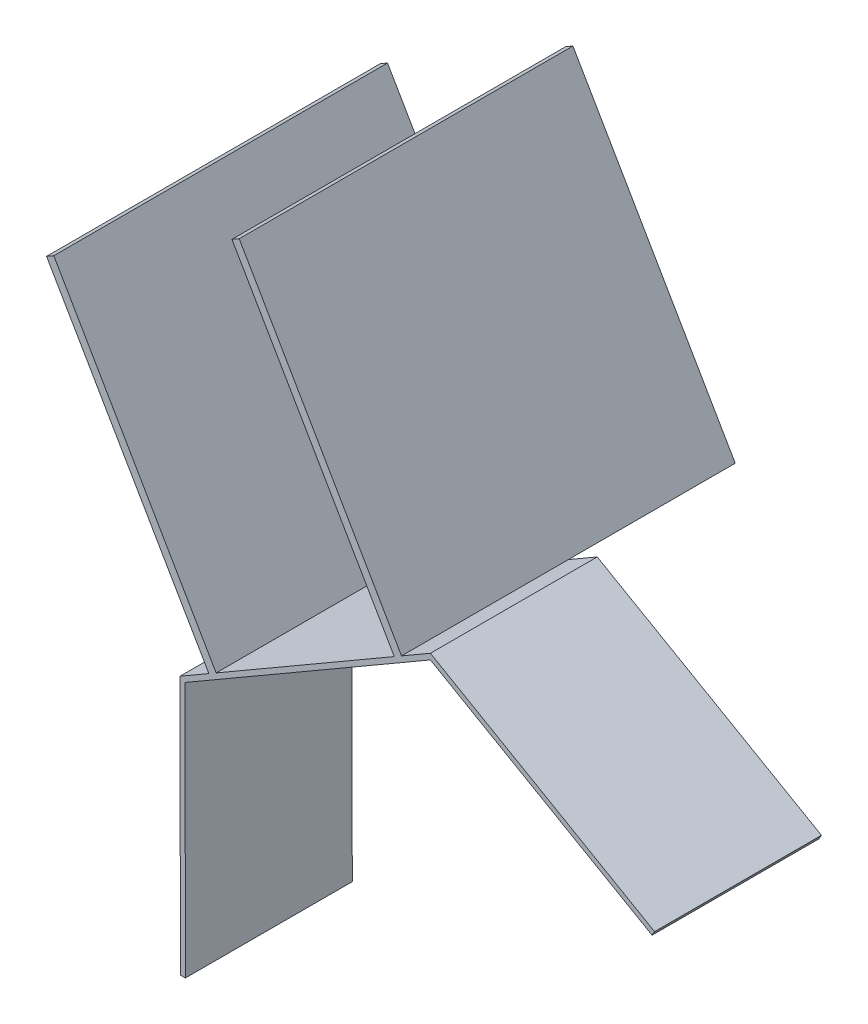
ISO-10303-21;
HEADER;
FILE_DESCRIPTION(('STEP AP214'),'2;1');
FILE_NAME('part.step','',(''),(''),'','','');
FILE_SCHEMA(('AUTOMOTIVE_DESIGN { 1 0 10303 214 1 1 1 1 }'));
ENDSEC;
DATA;
#1=APPLICATION_CONTEXT('core data for automotive mechanical design processes');
#2=APPLICATION_PROTOCOL_DEFINITION('international standard','automotive_design',2000,#1);
#3=PRODUCT_CONTEXT('',#1,'mechanical');
#4=PRODUCT('Part','Part','',(#3));
#5=PRODUCT_RELATED_PRODUCT_CATEGORY('part','',(#4));
#6=PRODUCT_DEFINITION_FORMATION('','',#4);
#7=PRODUCT_DEFINITION_CONTEXT('part definition',#1,'design');
#8=PRODUCT_DEFINITION('design','',#6,#7);
#9=PRODUCT_DEFINITION_SHAPE('','',#8);
#10=(LENGTH_UNIT() NAMED_UNIT(*) SI_UNIT(.MILLI.,.METRE.));
#11=(NAMED_UNIT(*) PLANE_ANGLE_UNIT() SI_UNIT($,.RADIAN.));
#12=(NAMED_UNIT(*) SI_UNIT($,.STERADIAN.) SOLID_ANGLE_UNIT());
#13=UNCERTAINTY_MEASURE_WITH_UNIT(LENGTH_MEASURE(1.E-05),#10,'distance_accuracy_value','');
#14=(GEOMETRIC_REPRESENTATION_CONTEXT(3) GLOBAL_UNCERTAINTY_ASSIGNED_CONTEXT((#13)) GLOBAL_UNIT_ASSIGNED_CONTEXT((#10,
#11,#12)) REPRESENTATION_CONTEXT('',''));
#15=CARTESIAN_POINT('',(0.,0.,0.));
#16=DIRECTION('',(0.,0.,1.));
#17=DIRECTION('',(1.,0.,0.));
#18=AXIS2_PLACEMENT_3D('',#15,#16,#17);
#19=CARTESIAN_POINT('',(-529.334093447902,913.551431110648,50.));
#20=DIRECTION('',(-0.501345446576402,0.865247215076193,0.));
#21=DIRECTION('',(-0.865247215076193,-0.501345446576402,0.));
#22=AXIS2_PLACEMENT_3D('',#19,#20,#21);
#23=PLANE('',#22);
#24=DIRECTION('',(0.865247215076193,0.501345446576402,0.));
#25=VECTOR('',#24,1.);
#26=CARTESIAN_POINT('',(-529.334093447902,913.551431110648,50.));
#27=LINE('',#26,#25);
#28=CARTESIAN_POINT('',(-605.658970562719,869.326926327183,50.));
#29=VERTEX_POINT('',#28);
#30=CARTESIAN_POINT('',(-588.354026261196,879.353835258712,50.));
#31=VERTEX_POINT('',#30);
#32=EDGE_CURVE('E233',#29,#31,#27,.T.);
#33=ORIENTED_EDGE('',*,*,#32,.T.);
#34=DIRECTION('',(0.,0.,1.));
#35=VECTOR('',#34,1.);
#36=CARTESIAN_POINT('',(-588.354026261196,879.353835258712,-150.));
#37=LINE('',#36,#35);
#38=CARTESIAN_POINT('',(-588.354026261196,879.353835258712,-50.));
#39=VERTEX_POINT('',#38);
#40=EDGE_CURVE('E189',#39,#31,#37,.T.);
#41=ORIENTED_EDGE('',*,*,#40,.F.);
#42=DIRECTION('',(0.865247215076193,0.501345446576402,0.));
#43=VECTOR('',#42,1.);
#44=CARTESIAN_POINT('',(-529.334093447902,913.551431110648,-50.));
#45=LINE('',#44,#43);
#46=CARTESIAN_POINT('',(-605.658970562719,869.326926327183,-50.));
#47=VERTEX_POINT('',#46);
#48=EDGE_CURVE('E256',#47,#39,#45,.T.);
#49=ORIENTED_EDGE('',*,*,#48,.F.);
#50=DIRECTION('',(0.,0.,-1.));
#51=VECTOR('',#50,1.);
#52=CARTESIAN_POINT('',(-605.658970562719,869.326926327183,50.));
#53=LINE('',#52,#51);
#54=EDGE_CURVE('E280',#29,#47,#53,.T.);
#55=ORIENTED_EDGE('',*,*,#54,.F.);
#56=EDGE_LOOP('',(#33,#41,#49,#55));
#57=FACE_BOUND('',#56,.T.);
#58=ADVANCED_FACE('F37',(#57),#23,.T.);
#59=CARTESIAN_POINT('',(-584.027790185814,881.860562491593,-50.));
#60=VERTEX_POINT('',#59);
#61=CARTESIAN_POINT('',(-477.253300681142,943.728319117628,-50.));
#62=VERTEX_POINT('',#61);
#63=EDGE_CURVE('E261',#60,#62,#45,.T.);
#64=ORIENTED_EDGE('',*,*,#63,.F.);
#65=DIRECTION('',(0.,0.,-1.));
#66=VECTOR('',#65,1.);
#67=CARTESIAN_POINT('',(-584.027790185815,881.860562491594,-150.));
#68=LINE('',#67,#66);
#69=CARTESIAN_POINT('',(-584.027790185815,881.860562491594,50.));
#70=VERTEX_POINT('',#69);
#71=EDGE_CURVE('E52',#70,#60,#68,.T.);
#72=ORIENTED_EDGE('',*,*,#71,.F.);
#73=CARTESIAN_POINT('',(-477.253300681142,943.728319117628,50.));
#74=VERTEX_POINT('',#73);
#75=EDGE_CURVE('E236',#70,#74,#27,.T.);
#76=ORIENTED_EDGE('',*,*,#75,.T.);
#77=DIRECTION('',(0.,0.,1.));
#78=VECTOR('',#77,1.);
#79=CARTESIAN_POINT('',(-477.253300681142,943.728319117628,-150.));
#80=LINE('',#79,#78);
#81=EDGE_CURVE('E210',#62,#74,#80,.T.);
#82=ORIENTED_EDGE('',*,*,#81,.F.);
#83=EDGE_LOOP('',(#64,#72,#76,#82));
#84=FACE_BOUND('',#83,.T.);
#85=ADVANCED_FACE('F356',(#84),#23,.T.);
#86=CARTESIAN_POINT('',(-472.92706460576,946.235046350509,-50.));
#87=VERTEX_POINT('',#86);
#88=CARTESIAN_POINT('',(-455.622120304236,956.261955282037,-50.));
#89=VERTEX_POINT('',#88);
#90=EDGE_CURVE('E255',#87,#89,#45,.T.);
#91=ORIENTED_EDGE('',*,*,#90,.F.);
#92=DIRECTION('',(0.,0.,-1.));
#93=VECTOR('',#92,1.);
#94=CARTESIAN_POINT('',(-472.927064605761,946.23504635051,-150.));
#95=LINE('',#94,#93);
#96=CARTESIAN_POINT('',(-472.927064605761,946.23504635051,50.));
#97=VERTEX_POINT('',#96);
#98=EDGE_CURVE('E60',#97,#87,#95,.T.);
#99=ORIENTED_EDGE('',*,*,#98,.F.);
#100=CARTESIAN_POINT('',(-455.622120304236,956.261955282037,50.));
#101=VERTEX_POINT('',#100);
#102=EDGE_CURVE('E232',#97,#101,#27,.T.);
#103=ORIENTED_EDGE('',*,*,#102,.T.);
#104=DIRECTION('',(0.,0.,-1.));
#105=VECTOR('',#104,1.);
#106=CARTESIAN_POINT('',(-455.622120304236,956.261955282037,50.));
#107=LINE('',#106,#105);
#108=EDGE_CURVE('E282',#101,#89,#107,.T.);
#109=ORIENTED_EDGE('',*,*,#108,.T.);
#110=EDGE_LOOP('',(#91,#99,#103,#109));
#111=FACE_BOUND('',#110,.T.);
#112=ADVANCED_FACE('F300',(#111),#23,.T.);
#113=CARTESIAN_POINT('',(298.541533198217,518.923634133479,50.));
#114=DIRECTION('',(0.498672519084214,0.866790469900428,0.));
#115=DIRECTION('',(-0.866790469900428,0.498672519084214,0.));
#116=AXIS2_PLACEMENT_3D('',#113,#114,#115);
#117=PLANE('',#116);
#118=DIRECTION('',(0.866790469900428,-0.498672519084214,0.));
#119=VECTOR('',#118,1.);
#120=CARTESIAN_POINT('',(298.541533198217,518.923634133479,-50.));
#121=LINE('',#120,#119);
#122=CARTESIAN_POINT('',(-455.616774380978,952.79783567149,-50.));
#123=VERTEX_POINT('',#122);
#124=CARTESIAN_POINT('',(-322.765615026922,876.367343414283,-50.));
#125=VERTEX_POINT('',#124);
#126=EDGE_CURVE('E223',#123,#125,#121,.T.);
#127=ORIENTED_EDGE('',*,*,#126,.T.);
#128=DIRECTION('',(0.,0.,-1.));
#129=VECTOR('',#128,1.);
#130=CARTESIAN_POINT('',(-322.765615026922,876.367343414283,50.));
#131=LINE('',#130,#129);
#132=CARTESIAN_POINT('',(-322.765615026922,876.367343414283,50.));
#133=VERTEX_POINT('',#132);
#134=EDGE_CURVE('E11',#133,#125,#131,.T.);
#135=ORIENTED_EDGE('',*,*,#134,.F.);
#136=DIRECTION('',(0.866790469900428,-0.498672519084214,0.));
#137=VECTOR('',#136,1.);
#138=CARTESIAN_POINT('',(298.541533198217,518.923634133479,50.));
#139=LINE('',#138,#137);
#140=CARTESIAN_POINT('',(-455.616774380978,952.79783567149,50.));
#141=VERTEX_POINT('',#140);
#142=EDGE_CURVE('E224',#141,#133,#139,.T.);
#143=ORIENTED_EDGE('',*,*,#142,.F.);
#144=DIRECTION('',(0.,0.,-1.));
#145=VECTOR('',#144,1.);
#146=CARTESIAN_POINT('',(-455.616774380978,952.79783567149,50.));
#147=LINE('',#146,#145);
#148=EDGE_CURVE('E246',#141,#123,#147,.T.);
#149=ORIENTED_EDGE('',*,*,#148,.T.);
#150=EDGE_LOOP('',(#127,#135,#143,#149));
#151=FACE_BOUND('',#150,.T.);
#152=ADVANCED_FACE('F39',(#151),#117,.F.);
#153=CARTESIAN_POINT('',(-621.307148225138,357.443709280794,50.));
#154=DIRECTION('',(-0.866790469900433,0.498672519084205,0.));
#155=DIRECTION('',(-0.498672519084205,-0.866790469900433,0.));
#156=AXIS2_PLACEMENT_3D('',#153,#154,#155);
#157=PLANE('',#156);
#158=DIRECTION('',(0.498672519084205,0.866790469900433,0.));
#159=VECTOR('',#158,1.);
#160=CARTESIAN_POINT('',(-621.307148225138,357.443709280794,-50.));
#161=LINE('',#160,#159);
#162=CARTESIAN_POINT('',(-321.26959746967,878.967714823984,-50.));
#163=VERTEX_POINT('',#162);
#164=EDGE_CURVE('E249',#125,#163,#161,.T.);
#165=ORIENTED_EDGE('',*,*,#164,.T.);
#166=DIRECTION('',(0.,0.,-1.));
#167=VECTOR('',#166,1.);
#168=CARTESIAN_POINT('',(-321.26959746967,878.967714823984,50.));
#169=LINE('',#168,#167);
#170=CARTESIAN_POINT('',(-321.26959746967,878.967714823984,50.));
#171=VERTEX_POINT('',#170);
#172=EDGE_CURVE('E45',#171,#163,#169,.T.);
#173=ORIENTED_EDGE('',*,*,#172,.F.);
#174=DIRECTION('',(0.498672519084205,0.866790469900433,0.));
#175=VECTOR('',#174,1.);
#176=CARTESIAN_POINT('',(-621.307148225138,357.443709280794,50.));
#177=LINE('',#176,#175);
#178=EDGE_CURVE('E226',#133,#171,#177,.T.);
#179=ORIENTED_EDGE('',*,*,#178,.F.);
#180=ORIENTED_EDGE('',*,*,#134,.T.);
#181=EDGE_LOOP('',(#165,#173,#179,#180));
#182=FACE_BOUND('',#181,.T.);
#183=ADVANCED_FACE('F291',(#182),#157,.F.);
#184=CARTESIAN_POINT('',(300.03755075547,521.52400554318,50.));
#185=DIRECTION('',(0.498672519084214,0.866790469900428,0.));
#186=DIRECTION('',(-0.866790469900428,0.498672519084214,0.));
#187=AXIS2_PLACEMENT_3D('',#184,#185,#186);
#188=PLANE('',#187);
#189=DIRECTION('',(0.866790469900428,-0.498672519084214,0.));
#190=VECTOR('',#189,1.);
#191=CARTESIAN_POINT('',(300.03755075547,521.52400554318,-50.));
#192=LINE('',#191,#190);
#193=EDGE_CURVE('E252',#89,#163,#192,.T.);
#194=ORIENTED_EDGE('',*,*,#193,.F.);
#195=ORIENTED_EDGE('',*,*,#108,.F.);
#196=DIRECTION('',(0.866790469900428,-0.498672519084214,0.));
#197=VECTOR('',#196,1.);
#198=CARTESIAN_POINT('',(300.03755075547,521.52400554318,50.));
#199=LINE('',#198,#197);
#200=EDGE_CURVE('E229',#101,#171,#199,.T.);
#201=ORIENTED_EDGE('',*,*,#200,.T.);
#202=ORIENTED_EDGE('',*,*,#172,.T.);
#203=EDGE_LOOP('',(#194,#195,#201,#202));
#204=FACE_BOUND('',#203,.T.);
#205=ADVANCED_FACE('F287',(#204),#188,.T.);
#206=CARTESIAN_POINT('',(-604.325597812315,-0.925927769958897,50.));
#207=DIRECTION('',(-0.999998826234128,-0.00153216525410867,0.));
#208=DIRECTION('',(0.00153216525410867,-0.999998826234128,0.));
#209=AXIS2_PLACEMENT_3D('',#206,#207,#208);
#210=PLANE('',#209);
#211=DIRECTION('',(-0.00153216525410867,0.999998826234128,0.));
#212=VECTOR('',#211,1.);
#213=CARTESIAN_POINT('',(-604.325597812315,-0.925927769958897,-50.));
#214=LINE('',#213,#212);
#215=CARTESIAN_POINT('',(-605.421491464646,714.331361265699,-50.));
#216=VERTEX_POINT('',#215);
#217=EDGE_CURVE('E259',#216,#47,#214,.T.);
#218=ORIENTED_EDGE('',*,*,#217,.F.);
#219=DIRECTION('',(0.,0.,-1.));
#220=VECTOR('',#219,1.);
#221=CARTESIAN_POINT('',(-605.421491464646,714.331361265699,50.));
#222=LINE('',#221,#220);
#223=CARTESIAN_POINT('',(-605.421491464646,714.331361265699,50.));
#224=VERTEX_POINT('',#223);
#225=EDGE_CURVE('E278',#224,#216,#222,.T.);
#226=ORIENTED_EDGE('',*,*,#225,.F.);
#227=DIRECTION('',(-0.00153216525410867,0.999998826234128,0.));
#228=VECTOR('',#227,1.);
#229=CARTESIAN_POINT('',(-604.325597812315,-0.925927769958897,50.));
#230=LINE('',#229,#228);
#231=EDGE_CURVE('E235',#224,#29,#230,.T.);
#232=ORIENTED_EDGE('',*,*,#231,.T.);
#233=ORIENTED_EDGE('',*,*,#54,.T.);
#234=EDGE_LOOP('',(#218,#226,#232,#233));
#235=FACE_BOUND('',#234,.T.);
#236=ADVANCED_FACE('F323',(#235),#210,.T.);
#237=CARTESIAN_POINT('',(0.,714.331361265699,50.));
#238=DIRECTION('',(0.,-1.,0.));
#239=DIRECTION('',(0.,0.,-1.));
#240=AXIS2_PLACEMENT_3D('',#237,#238,#239);
#241=PLANE('',#240);
#242=DIRECTION('',(-1.,0.,0.));
#243=VECTOR('',#242,1.);
#244=CARTESIAN_POINT('',(0.,714.331361265699,-50.));
#245=LINE('',#244,#243);
#246=CARTESIAN_POINT('',(-602.421487943344,714.331361265699,-50.));
#247=VERTEX_POINT('',#246);
#248=EDGE_CURVE('E265',#247,#216,#245,.T.);
#249=ORIENTED_EDGE('',*,*,#248,.F.);
#250=DIRECTION('',(0.,0.,-1.));
#251=VECTOR('',#250,1.);
#252=CARTESIAN_POINT('',(-602.421487943344,714.331361265699,50.));
#253=LINE('',#252,#251);
#254=CARTESIAN_POINT('',(-602.421487943344,714.331361265699,50.));
#255=VERTEX_POINT('',#254);
#256=EDGE_CURVE('E276',#255,#247,#253,.T.);
#257=ORIENTED_EDGE('',*,*,#256,.F.);
#258=DIRECTION('',(-1.,0.,0.));
#259=VECTOR('',#258,1.);
#260=CARTESIAN_POINT('',(0.,714.331361265699,50.));
#261=LINE('',#260,#259);
#262=EDGE_CURVE('E239',#255,#224,#261,.T.);
#263=ORIENTED_EDGE('',*,*,#262,.T.);
#264=ORIENTED_EDGE('',*,*,#225,.T.);
#265=EDGE_LOOP('',(#249,#257,#263,#264));
#266=FACE_BOUND('',#265,.T.);
#267=ADVANCED_FACE('F318',(#266),#241,.T.);
#268=CARTESIAN_POINT('',(-601.325601333613,-0.92133127419667,50.));
#269=DIRECTION('',(-0.999998826234128,-0.00153216525410884,0.));
#270=DIRECTION('',(0.00153216525410884,-0.999998826234128,0.));
#271=AXIS2_PLACEMENT_3D('',#268,#269,#270);
#272=PLANE('',#271);
#273=DIRECTION('',(-0.00153216525410884,0.999998826234128,0.));
#274=VECTOR('',#273,1.);
#275=CARTESIAN_POINT('',(-601.325601333613,-0.92133127419667,-50.));
#276=LINE('',#275,#274);
#277=CARTESIAN_POINT('',(-602.656320363734,867.599518288146,-50.));
#278=VERTEX_POINT('',#277);
#279=EDGE_CURVE('E268',#247,#278,#276,.T.);
#280=ORIENTED_EDGE('',*,*,#279,.T.);
#281=DIRECTION('',(0.,0.,-1.));
#282=VECTOR('',#281,1.);
#283=CARTESIAN_POINT('',(-602.656320363734,867.599518288146,50.));
#284=LINE('',#283,#282);
#285=CARTESIAN_POINT('',(-602.656320363734,867.599518288146,50.));
#286=VERTEX_POINT('',#285);
#287=EDGE_CURVE('E273',#286,#278,#284,.T.);
#288=ORIENTED_EDGE('',*,*,#287,.F.);
#289=DIRECTION('',(-0.00153216525410884,0.999998826234128,0.));
#290=VECTOR('',#289,1.);
#291=CARTESIAN_POINT('',(-601.325601333613,-0.92133127419667,50.));
#292=LINE('',#291,#290);
#293=EDGE_CURVE('E242',#255,#286,#292,.T.);
#294=ORIENTED_EDGE('',*,*,#293,.F.);
#295=ORIENTED_EDGE('',*,*,#256,.T.);
#296=EDGE_LOOP('',(#280,#288,#294,#295));
#297=FACE_BOUND('',#296,.T.);
#298=ADVANCED_FACE('F315',(#297),#272,.F.);
#299=CARTESIAN_POINT('',(-527.830057108174,910.955689465419,50.));
#300=DIRECTION('',(-0.501345446576403,0.865247215076193,0.));
#301=DIRECTION('',(-0.865247215076193,-0.501345446576403,0.));
#302=AXIS2_PLACEMENT_3D('',#299,#300,#301);
#303=PLANE('',#302);
#304=DIRECTION('',(0.865247215076193,0.501345446576403,0.));
#305=VECTOR('',#304,1.);
#306=CARTESIAN_POINT('',(-527.830057108174,910.955689465419,-50.));
#307=LINE('',#306,#305);
#308=EDGE_CURVE('E227',#278,#123,#307,.T.);
#309=ORIENTED_EDGE('',*,*,#308,.T.);
#310=ORIENTED_EDGE('',*,*,#148,.F.);
#311=DIRECTION('',(0.865247215076193,0.501345446576403,0.));
#312=VECTOR('',#311,1.);
#313=CARTESIAN_POINT('',(-527.830057108174,910.955689465419,50.));
#314=LINE('',#313,#312);
#315=EDGE_CURVE('E244',#286,#141,#314,.T.);
#316=ORIENTED_EDGE('',*,*,#315,.F.);
#317=ORIENTED_EDGE('',*,*,#287,.T.);
#318=EDGE_LOOP('',(#309,#310,#316,#317));
#319=FACE_BOUND('',#318,.T.);
#320=ADVANCED_FACE('F311',(#319),#303,.F.);
#321=CARTESIAN_POINT('',(0.,0.,50.));
#322=DIRECTION('',(0.,0.,1.));
#323=DIRECTION('',(1.,0.,0.));
#324=AXIS2_PLACEMENT_3D('',#321,#322,#323);
#325=PLANE('',#324);
#326=ORIENTED_EDGE('',*,*,#142,.T.);
#327=ORIENTED_EDGE('',*,*,#178,.T.);
#328=ORIENTED_EDGE('',*,*,#200,.F.);
#329=ORIENTED_EDGE('',*,*,#102,.F.);
#330=DIRECTION('',(0.501345446576402,-0.865247215076193,0.));
#331=VECTOR('',#330,1.);
#332=CARTESIAN_POINT('',(-570.208135059446,1114.12761596389,50.));
#333=LINE('',#332,#331);
#334=CARTESIAN_POINT('',(-570.208135059446,1114.12761596389,50.));
#335=VERTEX_POINT('',#334);
#336=EDGE_CURVE('E206',#335,#97,#333,.T.);
#337=ORIENTED_EDGE('',*,*,#336,.F.);
#338=DIRECTION('',(0.865247215076201,0.501345446576389,0.));
#339=VECTOR('',#338,1.);
#340=CARTESIAN_POINT('',(-570.208135059446,1114.12761596389,50.));
#341=LINE('',#340,#339);
#342=CARTESIAN_POINT('',(-574.534371134827,1111.62088873101,50.));
#343=VERTEX_POINT('',#342);
#344=EDGE_CURVE('E205',#343,#335,#341,.T.);
#345=ORIENTED_EDGE('',*,*,#344,.F.);
#346=DIRECTION('',(0.501345446576402,-0.865247215076193,0.));
#347=VECTOR('',#346,1.);
#348=CARTESIAN_POINT('',(-574.534371134827,1111.62088873101,50.));
#349=LINE('',#348,#347);
#350=EDGE_CURVE('E214',#343,#74,#349,.T.);
#351=ORIENTED_EDGE('',*,*,#350,.T.);
#352=ORIENTED_EDGE('',*,*,#75,.F.);
#353=DIRECTION('',(0.501345446576402,-0.865247215076193,0.));
#354=VECTOR('',#353,1.);
#355=CARTESIAN_POINT('',(-681.3088606395,1049.75313210498,50.));
#356=LINE('',#355,#354);
#357=CARTESIAN_POINT('',(-681.3088606395,1049.75313210498,50.));
#358=VERTEX_POINT('',#357);
#359=EDGE_CURVE('E171',#358,#70,#356,.T.);
#360=ORIENTED_EDGE('',*,*,#359,.F.);
#361=DIRECTION('',(0.865247215076191,0.501345446576406,0.));
#362=VECTOR('',#361,1.);
#363=CARTESIAN_POINT('',(-685.635096714881,1047.2464048721,50.));
#364=LINE('',#363,#362);
#365=CARTESIAN_POINT('',(-685.635096714881,1047.2464048721,50.));
#366=VERTEX_POINT('',#365);
#367=EDGE_CURVE('E162',#366,#358,#364,.T.);
#368=ORIENTED_EDGE('',*,*,#367,.F.);
#369=DIRECTION('',(0.501345446576402,-0.865247215076193,0.));
#370=VECTOR('',#369,1.);
#371=CARTESIAN_POINT('',(-685.635096714881,1047.2464048721,50.));
#372=LINE('',#371,#370);
#373=EDGE_CURVE('E168',#366,#31,#372,.T.);
#374=ORIENTED_EDGE('',*,*,#373,.T.);
#375=ORIENTED_EDGE('',*,*,#32,.F.);
#376=ORIENTED_EDGE('',*,*,#231,.F.);
#377=ORIENTED_EDGE('',*,*,#262,.F.);
#378=ORIENTED_EDGE('',*,*,#293,.T.);
#379=ORIENTED_EDGE('',*,*,#315,.T.);
#380=EDGE_LOOP('',(#326,#327,#328,#329,#337,#345,#351,#352,#360,#368,#374,#375,#376,#377,#378,#379));
#381=FACE_BOUND('',#380,.T.);
#382=ADVANCED_FACE('F165',(#381),#325,.T.);
#383=CARTESIAN_POINT('',(0.,0.,-50.));
#384=DIRECTION('',(0.,0.,1.));
#385=DIRECTION('',(1.,0.,0.));
#386=AXIS2_PLACEMENT_3D('',#383,#384,#385);
#387=PLANE('',#386);
#388=ORIENTED_EDGE('',*,*,#126,.F.);
#389=ORIENTED_EDGE('',*,*,#308,.F.);
#390=ORIENTED_EDGE('',*,*,#279,.F.);
#391=ORIENTED_EDGE('',*,*,#248,.T.);
#392=ORIENTED_EDGE('',*,*,#217,.T.);
#393=ORIENTED_EDGE('',*,*,#48,.T.);
#394=EDGE_CURVE('E260',#39,#60,#45,.T.);
#395=ORIENTED_EDGE('',*,*,#394,.T.);
#396=ORIENTED_EDGE('',*,*,#63,.T.);
#397=EDGE_CURVE('E262',#62,#87,#45,.T.);
#398=ORIENTED_EDGE('',*,*,#397,.T.);
#399=ORIENTED_EDGE('',*,*,#90,.T.);
#400=ORIENTED_EDGE('',*,*,#193,.T.);
#401=ORIENTED_EDGE('',*,*,#164,.F.);
#402=EDGE_LOOP('',(#388,#389,#390,#391,#392,#393,#395,#396,#398,#399,#400,#401));
#403=FACE_BOUND('',#402,.T.);
#404=ADVANCED_FACE('F295',(#403),#387,.F.);
#405=CARTESIAN_POINT('',(-529.33409344789,913.551431110657,2.93839449132466E-13));
#406=DIRECTION('',(0.501345446576389,-0.865247215076201,0.));
#407=DIRECTION('',(0.865247215076201,0.501345446576389,0.));
#408=AXIS2_PLACEMENT_3D('',#405,#406,#407);
#409=PLANE('',#408);
#410=ORIENTED_EDGE('',*,*,#397,.F.);
#411=CARTESIAN_POINT('',(-477.253300681142,943.728319117628,-150.));
#412=VERTEX_POINT('',#411);
#413=EDGE_CURVE('E201',#412,#62,#80,.T.);
#414=ORIENTED_EDGE('',*,*,#413,.F.);
#415=DIRECTION('',(-0.865247215076191,-0.501345446576406,0.));
#416=VECTOR('',#415,1.);
#417=CARTESIAN_POINT('',(-472.927064605761,946.23504635051,-150.));
#418=LINE('',#417,#416);
#419=CARTESIAN_POINT('',(-472.927064605761,946.23504635051,-150.));
#420=VERTEX_POINT('',#419);
#421=EDGE_CURVE('E208',#420,#412,#418,.T.);
#422=ORIENTED_EDGE('',*,*,#421,.F.);
#423=EDGE_CURVE('E190',#87,#420,#95,.T.);
#424=ORIENTED_EDGE('',*,*,#423,.F.);
#425=EDGE_LOOP('',(#410,#414,#422,#424));
#426=FACE_BOUND('',#425,.T.);
#427=ADVANCED_FACE('F348',(#426),#409,.T.);
#428=CARTESIAN_POINT('',(-570.208135059446,1114.12761596389,-150.));
#429=DIRECTION('',(-0.865247215076193,-0.501345446576402,0.));
#430=DIRECTION('',(0.501345446576402,-0.865247215076193,0.));
#431=AXIS2_PLACEMENT_3D('',#428,#429,#430);
#432=PLANE('',#431);
#433=ORIENTED_EDGE('',*,*,#98,.T.);
#434=ORIENTED_EDGE('',*,*,#423,.T.);
#435=DIRECTION('',(0.501345446576402,-0.865247215076193,0.));
#436=VECTOR('',#435,1.);
#437=CARTESIAN_POINT('',(-570.208135059446,1114.12761596389,-150.));
#438=LINE('',#437,#436);
#439=CARTESIAN_POINT('',(-570.208135059446,1114.12761596389,-150.));
#440=VERTEX_POINT('',#439);
#441=EDGE_CURVE('E220',#440,#420,#438,.T.);
#442=ORIENTED_EDGE('',*,*,#441,.F.);
#443=DIRECTION('',(0.,0.,-1.));
#444=VECTOR('',#443,1.);
#445=CARTESIAN_POINT('',(-570.208135059446,1114.12761596389,-150.));
#446=LINE('',#445,#444);
#447=EDGE_CURVE('E197',#335,#440,#446,.T.);
#448=ORIENTED_EDGE('',*,*,#447,.F.);
#449=ORIENTED_EDGE('',*,*,#336,.T.);
#450=EDGE_LOOP('',(#433,#434,#442,#448,#449));
#451=FACE_BOUND('',#450,.T.);
#452=ADVANCED_FACE('F364',(#451),#432,.F.);
#453=CARTESIAN_POINT('',(-570.208135059446,1114.12761596389,-150.));
#454=DIRECTION('',(0.,0.,1.));
#455=DIRECTION('',(1.,0.,0.));
#456=AXIS2_PLACEMENT_3D('',#453,#454,#455);
#457=PLANE('',#456);
#458=ORIENTED_EDGE('',*,*,#421,.T.);
#459=DIRECTION('',(0.501345446576402,-0.865247215076193,0.));
#460=VECTOR('',#459,1.);
#461=CARTESIAN_POINT('',(-574.534371134827,1111.62088873101,-150.));
#462=LINE('',#461,#460);
#463=CARTESIAN_POINT('',(-574.534371134827,1111.62088873101,-150.));
#464=VERTEX_POINT('',#463);
#465=EDGE_CURVE('E217',#464,#412,#462,.T.);
#466=ORIENTED_EDGE('',*,*,#465,.F.);
#467=DIRECTION('',(-0.865247215076191,-0.501345446576406,0.));
#468=VECTOR('',#467,1.);
#469=CARTESIAN_POINT('',(-570.208135059446,1114.12761596389,-150.));
#470=LINE('',#469,#468);
#471=EDGE_CURVE('E200',#440,#464,#470,.T.);
#472=ORIENTED_EDGE('',*,*,#471,.F.);
#473=ORIENTED_EDGE('',*,*,#441,.T.);
#474=EDGE_LOOP('',(#458,#466,#472,#473));
#475=FACE_BOUND('',#474,.T.);
#476=ADVANCED_FACE('F363',(#475),#457,.F.);
#477=CARTESIAN_POINT('',(-574.534371134827,1111.62088873101,-150.));
#478=DIRECTION('',(0.865247215076193,0.501345446576402,0.));
#479=DIRECTION('',(-0.501345446576402,0.865247215076193,0.));
#480=AXIS2_PLACEMENT_3D('',#477,#478,#479);
#481=PLANE('',#480);
#482=ORIENTED_EDGE('',*,*,#413,.T.);
#483=ORIENTED_EDGE('',*,*,#81,.T.);
#484=ORIENTED_EDGE('',*,*,#350,.F.);
#485=DIRECTION('',(0.,0.,1.));
#486=VECTOR('',#485,1.);
#487=CARTESIAN_POINT('',(-574.534371134827,1111.62088873101,-150.));
#488=LINE('',#487,#486);
#489=EDGE_CURVE('E203',#464,#343,#488,.T.);
#490=ORIENTED_EDGE('',*,*,#489,.F.);
#491=ORIENTED_EDGE('',*,*,#465,.T.);
#492=EDGE_LOOP('',(#482,#483,#484,#490,#491));
#493=FACE_BOUND('',#492,.T.);
#494=ADVANCED_FACE('F352',(#493),#481,.F.);
#495=CARTESIAN_POINT('',(-626.615163901575,1081.44400072404,2.93839449132466E-13));
#496=DIRECTION('',(0.501345446576389,-0.865247215076201,0.));
#497=DIRECTION('',(0.865247215076201,0.501345446576389,0.));
#498=AXIS2_PLACEMENT_3D('',#495,#496,#497);
#499=PLANE('',#498);
#500=ORIENTED_EDGE('',*,*,#447,.T.);
#501=ORIENTED_EDGE('',*,*,#471,.T.);
#502=ORIENTED_EDGE('',*,*,#489,.T.);
#503=ORIENTED_EDGE('',*,*,#344,.T.);
#504=EDGE_LOOP('',(#500,#501,#502,#503));
#505=FACE_BOUND('',#504,.T.);
#506=ADVANCED_FACE('F359',(#505),#499,.F.);
#507=CARTESIAN_POINT('',(-529.334093447907,913.551431110646,-2.13283467366676E-13));
#508=DIRECTION('',(-0.501345446576406,0.865247215076191,0.));
#509=DIRECTION('',(-0.865247215076191,-0.501345446576406,0.));
#510=AXIS2_PLACEMENT_3D('',#507,#508,#509);
#511=PLANE('',#510);
#512=CARTESIAN_POINT('',(-584.027790185815,881.860562491594,-150.));
#513=VERTEX_POINT('',#512);
#514=EDGE_CURVE('E328',#60,#513,#68,.T.);
#515=ORIENTED_EDGE('',*,*,#514,.F.);
#516=ORIENTED_EDGE('',*,*,#394,.F.);
#517=CARTESIAN_POINT('',(-588.354026261196,879.353835258712,-150.));
#518=VERTEX_POINT('',#517);
#519=EDGE_CURVE('E326',#518,#39,#37,.T.);
#520=ORIENTED_EDGE('',*,*,#519,.F.);
#521=DIRECTION('',(-0.865247215076191,-0.501345446576406,0.));
#522=VECTOR('',#521,1.);
#523=CARTESIAN_POINT('',(-588.354026261196,879.353835258712,-150.));
#524=LINE('',#523,#522);
#525=EDGE_CURVE('E184',#513,#518,#524,.T.);
#526=ORIENTED_EDGE('',*,*,#525,.F.);
#527=EDGE_LOOP('',(#515,#516,#520,#526));
#528=FACE_BOUND('',#527,.T.);
#529=ADVANCED_FACE('F342',(#528),#511,.F.);
#530=CARTESIAN_POINT('',(-685.635096714881,1047.2464048721,-150.));
#531=DIRECTION('',(0.865247215076193,0.501345446576402,0.));
#532=DIRECTION('',(-0.501345446576402,0.865247215076193,0.));
#533=AXIS2_PLACEMENT_3D('',#530,#531,#532);
#534=PLANE('',#533);
#535=ORIENTED_EDGE('',*,*,#519,.T.);
#536=ORIENTED_EDGE('',*,*,#40,.T.);
#537=ORIENTED_EDGE('',*,*,#373,.F.);
#538=DIRECTION('',(0.,0.,1.));
#539=VECTOR('',#538,1.);
#540=CARTESIAN_POINT('',(-685.635096714881,1047.2464048721,-150.));
#541=LINE('',#540,#539);
#542=CARTESIAN_POINT('',(-685.635096714881,1047.2464048721,-150.));
#543=VERTEX_POINT('',#542);
#544=EDGE_CURVE('E175',#543,#366,#541,.T.);
#545=ORIENTED_EDGE('',*,*,#544,.F.);
#546=DIRECTION('',(0.501345446576402,-0.865247215076193,0.));
#547=VECTOR('',#546,1.);
#548=CARTESIAN_POINT('',(-685.635096714881,1047.2464048721,-150.));
#549=LINE('',#548,#547);
#550=EDGE_CURVE('E334',#543,#518,#549,.T.);
#551=ORIENTED_EDGE('',*,*,#550,.T.);
#552=EDGE_LOOP('',(#535,#536,#537,#545,#551));
#553=FACE_BOUND('',#552,.T.);
#554=ADVANCED_FACE('F187',(#553),#534,.F.);
#555=CARTESIAN_POINT('',(-681.3088606395,1049.75313210498,-150.));
#556=DIRECTION('',(-0.865247215076193,-0.501345446576402,0.));
#557=DIRECTION('',(0.501345446576402,-0.865247215076193,0.));
#558=AXIS2_PLACEMENT_3D('',#555,#556,#557);
#559=PLANE('',#558);
#560=ORIENTED_EDGE('',*,*,#71,.T.);
#561=ORIENTED_EDGE('',*,*,#514,.T.);
#562=DIRECTION('',(0.501345446576402,-0.865247215076193,0.));
#563=VECTOR('',#562,1.);
#564=CARTESIAN_POINT('',(-681.3088606395,1049.75313210498,-150.));
#565=LINE('',#564,#563);
#566=CARTESIAN_POINT('',(-681.3088606395,1049.75313210498,-150.));
#567=VERTEX_POINT('',#566);
#568=EDGE_CURVE('E193',#567,#513,#565,.T.);
#569=ORIENTED_EDGE('',*,*,#568,.F.);
#570=DIRECTION('',(0.,0.,-1.));
#571=VECTOR('',#570,1.);
#572=CARTESIAN_POINT('',(-681.3088606395,1049.75313210498,-150.));
#573=LINE('',#572,#571);
#574=EDGE_CURVE('E174',#358,#567,#573,.T.);
#575=ORIENTED_EDGE('',*,*,#574,.F.);
#576=ORIENTED_EDGE('',*,*,#359,.T.);
#577=EDGE_LOOP('',(#560,#561,#569,#575,#576));
#578=FACE_BOUND('',#577,.T.);
#579=ADVANCED_FACE('F460',(#578),#559,.F.);
#580=CARTESIAN_POINT('',(-685.635096714881,1047.2464048721,-150.));
#581=DIRECTION('',(0.,0.,1.));
#582=DIRECTION('',(1.,0.,0.));
#583=AXIS2_PLACEMENT_3D('',#580,#581,#582);
#584=PLANE('',#583);
#585=ORIENTED_EDGE('',*,*,#525,.T.);
#586=ORIENTED_EDGE('',*,*,#550,.F.);
#587=DIRECTION('',(-0.865247215076191,-0.501345446576406,0.));
#588=VECTOR('',#587,1.);
#589=CARTESIAN_POINT('',(-685.635096714881,1047.2464048721,-150.));
#590=LINE('',#589,#588);
#591=EDGE_CURVE('E180',#567,#543,#590,.T.);
#592=ORIENTED_EDGE('',*,*,#591,.F.);
#593=ORIENTED_EDGE('',*,*,#568,.T.);
#594=EDGE_LOOP('',(#585,#586,#592,#593));
#595=FACE_BOUND('',#594,.T.);
#596=ADVANCED_FACE('F339',(#595),#584,.F.);
#597=CARTESIAN_POINT('',(-626.615163901592,1081.44400072403,-2.13283467366676E-13));
#598=DIRECTION('',(-0.501345446576406,0.865247215076191,0.));
#599=DIRECTION('',(-0.865247215076191,-0.501345446576406,0.));
#600=AXIS2_PLACEMENT_3D('',#597,#598,#599);
#601=PLANE('',#600);
#602=ORIENTED_EDGE('',*,*,#544,.T.);
#603=ORIENTED_EDGE('',*,*,#367,.T.);
#604=ORIENTED_EDGE('',*,*,#574,.T.);
#605=ORIENTED_EDGE('',*,*,#591,.T.);
#606=EDGE_LOOP('',(#602,#603,#604,#605));
#607=FACE_BOUND('',#606,.T.);
#608=ADVANCED_FACE('F178',(#607),#601,.T.);
#609=CLOSED_SHELL('',(#58,#85,#112,#152,#183,#205,#236,#267,#298,#320,#382,#404,#427,#452,#476,
#494,#506,#529,#554,#579,#596,#608));
#610=MANIFOLD_SOLID_BREP('B2',#609);
#611=ADVANCED_BREP_SHAPE_REPRESENTATION('',(#18,#610),#14);
#612=SHAPE_DEFINITION_REPRESENTATION(#9,#611);
ENDSEC;
END-ISO-10303-21;
